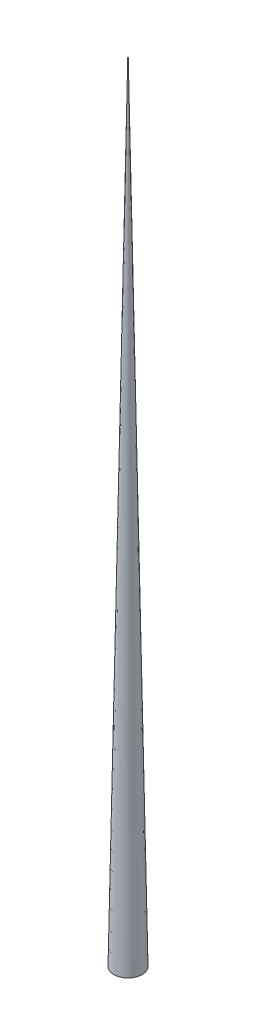
ISO-10303-21;
HEADER;
FILE_DESCRIPTION(('STEP AP214'),'2;1');
FILE_NAME('part.step','',(''),(''),'','','');
FILE_SCHEMA(('AUTOMOTIVE_DESIGN { 1 0 10303 214 1 1 1 1 }'));
ENDSEC;
DATA;
#1=APPLICATION_CONTEXT('core data for automotive mechanical design processes');
#2=APPLICATION_PROTOCOL_DEFINITION('international standard','automotive_design',2000,#1);
#3=PRODUCT_CONTEXT('',#1,'mechanical');
#4=PRODUCT('Part','Part','',(#3));
#5=PRODUCT_RELATED_PRODUCT_CATEGORY('part','',(#4));
#6=PRODUCT_DEFINITION_FORMATION('','',#4);
#7=PRODUCT_DEFINITION_CONTEXT('part definition',#1,'design');
#8=PRODUCT_DEFINITION('design','',#6,#7);
#9=PRODUCT_DEFINITION_SHAPE('','',#8);
#10=(LENGTH_UNIT() NAMED_UNIT(*) SI_UNIT(.MILLI.,.METRE.));
#11=(NAMED_UNIT(*) PLANE_ANGLE_UNIT() SI_UNIT($,.RADIAN.));
#12=(NAMED_UNIT(*) SI_UNIT($,.STERADIAN.) SOLID_ANGLE_UNIT());
#13=UNCERTAINTY_MEASURE_WITH_UNIT(LENGTH_MEASURE(1.E-05),#10,'distance_accuracy_value','');
#14=(GEOMETRIC_REPRESENTATION_CONTEXT(3) GLOBAL_UNCERTAINTY_ASSIGNED_CONTEXT((#13)) GLOBAL_UNIT_ASSIGNED_CONTEXT((#10,
#11,#12)) REPRESENTATION_CONTEXT('',''));
#15=CARTESIAN_POINT('',(0.,0.,0.));
#16=DIRECTION('',(0.,0.,1.));
#17=DIRECTION('',(1.,0.,0.));
#18=AXIS2_PLACEMENT_3D('',#15,#16,#17);
#19=CARTESIAN_POINT('',(0.,-228.6,0.));
#20=DIRECTION('',(0.,-1.,0.));
#21=DIRECTION('',(0.,0.,-1.));
#22=AXIS2_PLACEMENT_3D('',#19,#20,#21);
#23=CONICAL_SURFACE('',#22,4.064,0.0177759052476212);
#24=CARTESIAN_POINT('',(0.,0.,0.));
#25=VERTEX_POINT('',#24);
#26=VERTEX_LOOP('',#25);
#27=FACE_BOUND('',#26,.T.);
#28=CARTESIAN_POINT('',(0.,-228.6,0.));
#29=DIRECTION('',(0.,1.,0.));
#30=DIRECTION('',(0.,0.,1.));
#31=AXIS2_PLACEMENT_3D('',#28,#29,#30);
#32=CIRCLE('',#31,4.064);
#33=CARTESIAN_POINT('',(0.,-228.6,4.06399999999997));
#34=VERTEX_POINT('',#33);
#35=EDGE_CURVE('E11',#34,#34,#32,.T.);
#36=ORIENTED_EDGE('',*,*,#35,.T.);
#37=EDGE_LOOP('',(#36));
#38=FACE_BOUND('',#37,.T.);
#39=ADVANCED_FACE('F34',(#27,#38),#23,.T.);
#40=CARTESIAN_POINT('',(0.,-228.6,0.));
#41=DIRECTION('',(0.,1.,0.));
#42=DIRECTION('',(0.,0.,1.));
#43=AXIS2_PLACEMENT_3D('',#40,#41,#42);
#44=PLANE('',#43);
#45=ORIENTED_EDGE('',*,*,#35,.F.);
#46=EDGE_LOOP('',(#45));
#47=FACE_BOUND('',#46,.T.);
#48=ADVANCED_FACE('F43',(#47),#44,.F.);
#49=CLOSED_SHELL('',(#39,#48));
#50=MANIFOLD_SOLID_BREP('B2',#49);
#51=ADVANCED_BREP_SHAPE_REPRESENTATION('',(#18,#50),#14);
#52=SHAPE_DEFINITION_REPRESENTATION(#9,#51);
ENDSEC;
END-ISO-10303-21;
